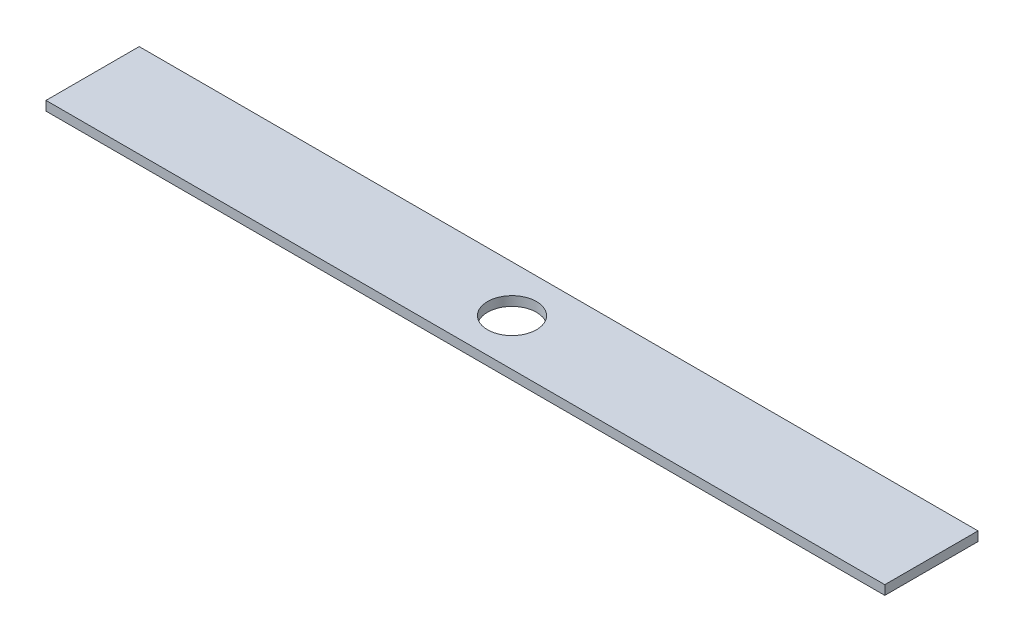
ISO-10303-21;
HEADER;
FILE_DESCRIPTION(('STEP AP214'),'2;1');
FILE_NAME('part.step','',(''),(''),'','','');
FILE_SCHEMA(('AUTOMOTIVE_DESIGN { 1 0 10303 214 1 1 1 1 }'));
ENDSEC;
DATA;
#1=APPLICATION_CONTEXT('core data for automotive mechanical design processes');
#2=APPLICATION_PROTOCOL_DEFINITION('international standard','automotive_design',2000,#1);
#3=PRODUCT_CONTEXT('',#1,'mechanical');
#4=PRODUCT('Part','Part','',(#3));
#5=PRODUCT_RELATED_PRODUCT_CATEGORY('part','',(#4));
#6=PRODUCT_DEFINITION_FORMATION('','',#4);
#7=PRODUCT_DEFINITION_CONTEXT('part definition',#1,'design');
#8=PRODUCT_DEFINITION('design','',#6,#7);
#9=PRODUCT_DEFINITION_SHAPE('','',#8);
#10=(LENGTH_UNIT() NAMED_UNIT(*) SI_UNIT(.MILLI.,.METRE.));
#11=(NAMED_UNIT(*) PLANE_ANGLE_UNIT() SI_UNIT($,.RADIAN.));
#12=(NAMED_UNIT(*) SI_UNIT($,.STERADIAN.) SOLID_ANGLE_UNIT());
#13=UNCERTAINTY_MEASURE_WITH_UNIT(LENGTH_MEASURE(1.E-05),#10,'distance_accuracy_value','');
#14=(GEOMETRIC_REPRESENTATION_CONTEXT(3) GLOBAL_UNCERTAINTY_ASSIGNED_CONTEXT((#13)) GLOBAL_UNIT_ASSIGNED_CONTEXT((#10,
#11,#12)) REPRESENTATION_CONTEXT('',''));
#15=CARTESIAN_POINT('',(0.,0.,0.));
#16=DIRECTION('',(0.,0.,1.));
#17=DIRECTION('',(1.,0.,0.));
#18=AXIS2_PLACEMENT_3D('',#15,#16,#17);
#19=CARTESIAN_POINT('',(0.,1.,0.));
#20=DIRECTION('',(0.,-1.,0.));
#21=DIRECTION('',(0.,0.,-1.));
#22=AXIS2_PLACEMENT_3D('',#19,#20,#21);
#23=PLANE('',#22);
#24=DIRECTION('',(0.,0.,1.));
#25=VECTOR('',#24,1.);
#26=CARTESIAN_POINT('',(-90.,1.,-9.99999999999999));
#27=LINE('',#26,#25);
#28=CARTESIAN_POINT('',(-90.,1.,-9.99999999999999));
#29=VERTEX_POINT('',#28);
#30=CARTESIAN_POINT('',(-90.,1.,10.));
#31=VERTEX_POINT('',#30);
#32=EDGE_CURVE('E87',#29,#31,#27,.T.);
#33=ORIENTED_EDGE('',*,*,#32,.T.);
#34=DIRECTION('',(1.,0.,0.));
#35=VECTOR('',#34,1.);
#36=CARTESIAN_POINT('',(90.,1.,9.99999999999999));
#37=LINE('',#36,#35);
#38=CARTESIAN_POINT('',(90.,1.,9.99999999999999));
#39=VERTEX_POINT('',#38);
#40=EDGE_CURVE('E82',#31,#39,#37,.T.);
#41=ORIENTED_EDGE('',*,*,#40,.T.);
#42=DIRECTION('',(0.,0.,-1.));
#43=VECTOR('',#42,1.);
#44=CARTESIAN_POINT('',(90.,1.,-10.));
#45=LINE('',#44,#43);
#46=CARTESIAN_POINT('',(90.,1.,-10.));
#47=VERTEX_POINT('',#46);
#48=EDGE_CURVE('E85',#39,#47,#45,.T.);
#49=ORIENTED_EDGE('',*,*,#48,.T.);
#50=DIRECTION('',(-1.,0.,0.));
#51=VECTOR('',#50,1.);
#52=CARTESIAN_POINT('',(90.,1.,-10.));
#53=LINE('',#52,#51);
#54=EDGE_CURVE('E52',#47,#29,#53,.T.);
#55=ORIENTED_EDGE('',*,*,#54,.T.);
#56=EDGE_LOOP('',(#33,#41,#49,#55));
#57=FACE_BOUND('',#56,.T.);
#58=CARTESIAN_POINT('',(0.,1.,0.));
#59=DIRECTION('',(0.,1.,0.));
#60=DIRECTION('',(0.,0.,1.));
#61=AXIS2_PLACEMENT_3D('',#58,#59,#60);
#62=CIRCLE('',#61,5.25);
#63=CARTESIAN_POINT('',(0.,1.,5.25));
#64=VERTEX_POINT('',#63);
#65=EDGE_CURVE('E102',#64,#64,#62,.T.);
#66=ORIENTED_EDGE('',*,*,#65,.F.);
#67=EDGE_LOOP('',(#66));
#68=FACE_BOUND('',#67,.T.);
#69=ADVANCED_FACE('F35',(#57,#68),#23,.F.);
#70=CARTESIAN_POINT('',(0.,-1.,0.));
#71=DIRECTION('',(0.,-1.,0.));
#72=DIRECTION('',(0.,0.,-1.));
#73=AXIS2_PLACEMENT_3D('',#70,#71,#72);
#74=PLANE('',#73);
#75=DIRECTION('',(0.,0.,1.));
#76=VECTOR('',#75,1.);
#77=CARTESIAN_POINT('',(-90.,-1.,-9.99999999999999));
#78=LINE('',#77,#76);
#79=CARTESIAN_POINT('',(-90.,-1.,-9.99999999999999));
#80=VERTEX_POINT('',#79);
#81=CARTESIAN_POINT('',(-90.,-1.,10.));
#82=VERTEX_POINT('',#81);
#83=EDGE_CURVE('E99',#80,#82,#78,.T.);
#84=ORIENTED_EDGE('',*,*,#83,.F.);
#85=DIRECTION('',(-1.,0.,0.));
#86=VECTOR('',#85,1.);
#87=CARTESIAN_POINT('',(90.,-1.,-10.));
#88=LINE('',#87,#86);
#89=CARTESIAN_POINT('',(90.,-1.,-10.));
#90=VERTEX_POINT('',#89);
#91=EDGE_CURVE('E75',#90,#80,#88,.T.);
#92=ORIENTED_EDGE('',*,*,#91,.F.);
#93=DIRECTION('',(0.,0.,-1.));
#94=VECTOR('',#93,1.);
#95=CARTESIAN_POINT('',(90.,-1.,-10.));
#96=LINE('',#95,#94);
#97=CARTESIAN_POINT('',(90.,-1.,9.99999999999999));
#98=VERTEX_POINT('',#97);
#99=EDGE_CURVE('E69',#98,#90,#96,.T.);
#100=ORIENTED_EDGE('',*,*,#99,.F.);
#101=DIRECTION('',(1.,0.,0.));
#102=VECTOR('',#101,1.);
#103=CARTESIAN_POINT('',(90.,-1.,9.99999999999999));
#104=LINE('',#103,#102);
#105=EDGE_CURVE('E91',#82,#98,#104,.T.);
#106=ORIENTED_EDGE('',*,*,#105,.F.);
#107=EDGE_LOOP('',(#84,#92,#100,#106));
#108=FACE_BOUND('',#107,.T.);
#109=CARTESIAN_POINT('',(0.,-1.,0.));
#110=DIRECTION('',(0.,1.,0.));
#111=DIRECTION('',(0.,0.,1.));
#112=AXIS2_PLACEMENT_3D('',#109,#110,#111);
#113=CIRCLE('',#112,5.25);
#114=CARTESIAN_POINT('',(0.,-1.,5.25));
#115=VERTEX_POINT('',#114);
#116=EDGE_CURVE('E114',#115,#115,#113,.T.);
#117=ORIENTED_EDGE('',*,*,#116,.T.);
#118=EDGE_LOOP('',(#117));
#119=FACE_BOUND('',#118,.T.);
#120=ADVANCED_FACE('F110',(#108,#119),#74,.T.);
#121=CARTESIAN_POINT('',(-90.,1.,-9.99999999999999));
#122=DIRECTION('',(1.,0.,0.));
#123=DIRECTION('',(0.,0.,-1.));
#124=AXIS2_PLACEMENT_3D('',#121,#122,#123);
#125=PLANE('',#124);
#126=ORIENTED_EDGE('',*,*,#83,.T.);
#127=DIRECTION('',(0.,-1.,0.));
#128=VECTOR('',#127,1.);
#129=CARTESIAN_POINT('',(-90.,1.,10.));
#130=LINE('',#129,#128);
#131=EDGE_CURVE('E11',#31,#82,#130,.T.);
#132=ORIENTED_EDGE('',*,*,#131,.F.);
#133=ORIENTED_EDGE('',*,*,#32,.F.);
#134=DIRECTION('',(0.,-1.,0.));
#135=VECTOR('',#134,1.);
#136=CARTESIAN_POINT('',(-90.,1.,-9.99999999999999));
#137=LINE('',#136,#135);
#138=EDGE_CURVE('E95',#29,#80,#137,.T.);
#139=ORIENTED_EDGE('',*,*,#138,.T.);
#140=EDGE_LOOP('',(#126,#132,#133,#139));
#141=FACE_BOUND('',#140,.T.);
#142=ADVANCED_FACE('F37',(#141),#125,.F.);
#143=CARTESIAN_POINT('',(90.,1.,9.99999999999999));
#144=DIRECTION('',(0.,0.,-1.));
#145=DIRECTION('',(-1.,0.,0.));
#146=AXIS2_PLACEMENT_3D('',#143,#144,#145);
#147=PLANE('',#146);
#148=ORIENTED_EDGE('',*,*,#105,.T.);
#149=DIRECTION('',(0.,-1.,0.));
#150=VECTOR('',#149,1.);
#151=CARTESIAN_POINT('',(90.,1.,9.99999999999999));
#152=LINE('',#151,#150);
#153=EDGE_CURVE('E44',#39,#98,#152,.T.);
#154=ORIENTED_EDGE('',*,*,#153,.F.);
#155=ORIENTED_EDGE('',*,*,#40,.F.);
#156=ORIENTED_EDGE('',*,*,#131,.T.);
#157=EDGE_LOOP('',(#148,#154,#155,#156));
#158=FACE_BOUND('',#157,.T.);
#159=ADVANCED_FACE('F90',(#158),#147,.F.);
#160=CARTESIAN_POINT('',(90.,1.,-10.));
#161=DIRECTION('',(-1.,0.,0.));
#162=DIRECTION('',(0.,0.,1.));
#163=AXIS2_PLACEMENT_3D('',#160,#161,#162);
#164=PLANE('',#163);
#165=ORIENTED_EDGE('',*,*,#99,.T.);
#166=DIRECTION('',(0.,-1.,0.));
#167=VECTOR('',#166,1.);
#168=CARTESIAN_POINT('',(90.,1.,-10.));
#169=LINE('',#168,#167);
#170=EDGE_CURVE('E92',#47,#90,#169,.T.);
#171=ORIENTED_EDGE('',*,*,#170,.F.);
#172=ORIENTED_EDGE('',*,*,#48,.F.);
#173=ORIENTED_EDGE('',*,*,#153,.T.);
#174=EDGE_LOOP('',(#165,#171,#172,#173));
#175=FACE_BOUND('',#174,.T.);
#176=ADVANCED_FACE('F93',(#175),#164,.F.);
#177=CARTESIAN_POINT('',(90.,1.,-10.));
#178=DIRECTION('',(0.,0.,1.));
#179=DIRECTION('',(1.,0.,0.));
#180=AXIS2_PLACEMENT_3D('',#177,#178,#179);
#181=PLANE('',#180);
#182=ORIENTED_EDGE('',*,*,#91,.T.);
#183=ORIENTED_EDGE('',*,*,#138,.F.);
#184=ORIENTED_EDGE('',*,*,#54,.F.);
#185=ORIENTED_EDGE('',*,*,#170,.T.);
#186=EDGE_LOOP('',(#182,#183,#184,#185));
#187=FACE_BOUND('',#186,.T.);
#188=ADVANCED_FACE('F107',(#187),#181,.F.);
#189=CARTESIAN_POINT('',(0.,1.,0.));
#190=DIRECTION('',(0.,-1.,0.));
#191=DIRECTION('',(0.,0.,-1.));
#192=AXIS2_PLACEMENT_3D('',#189,#190,#191);
#193=CYLINDRICAL_SURFACE('',#192,5.25);
#194=ORIENTED_EDGE('',*,*,#65,.T.);
#195=EDGE_LOOP('',(#194));
#196=FACE_BOUND('',#195,.T.);
#197=ORIENTED_EDGE('',*,*,#116,.F.);
#198=EDGE_LOOP('',(#197));
#199=FACE_BOUND('',#198,.T.);
#200=ADVANCED_FACE('F120',(#196,#199),#193,.F.);
#201=CLOSED_SHELL('',(#69,#120,#142,#159,#176,#188,#200));
#202=MANIFOLD_SOLID_BREP('B2',#201);
#203=ADVANCED_BREP_SHAPE_REPRESENTATION('',(#18,#202),#14);
#204=SHAPE_DEFINITION_REPRESENTATION(#9,#203);
ENDSEC;
END-ISO-10303-21;
